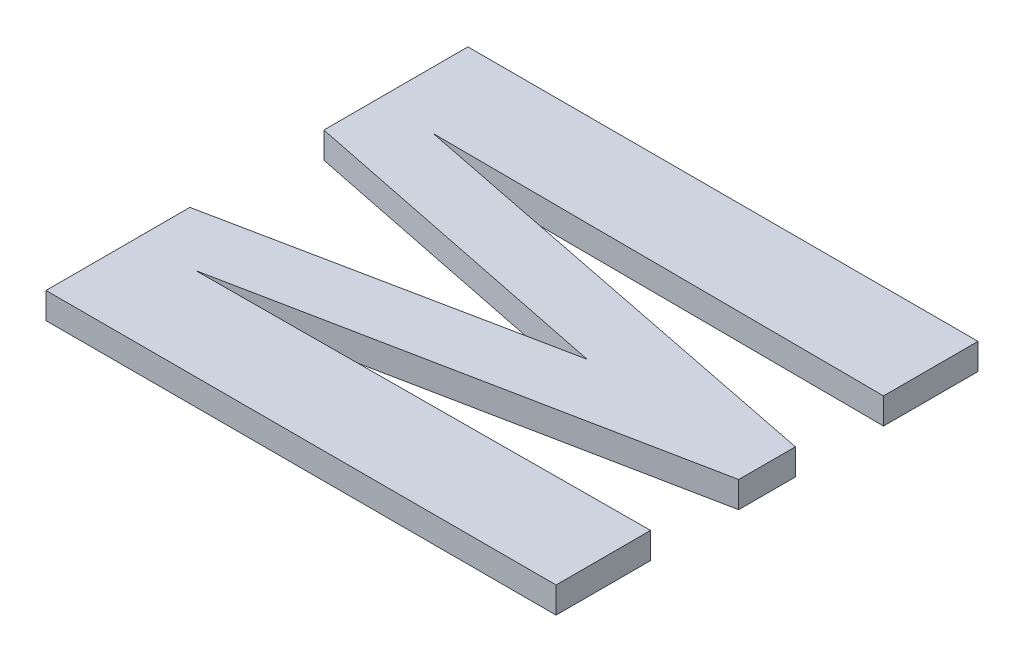
ISO-10303-21;
HEADER;
FILE_DESCRIPTION(('STEP AP214'),'2;1');
FILE_NAME('part.step','',(''),(''),'','','');
FILE_SCHEMA(('AUTOMOTIVE_DESIGN { 1 0 10303 214 1 1 1 1 }'));
ENDSEC;
DATA;
#1=APPLICATION_CONTEXT('core data for automotive mechanical design processes');
#2=APPLICATION_PROTOCOL_DEFINITION('international standard','automotive_design',2000,#1);
#3=PRODUCT_CONTEXT('',#1,'mechanical');
#4=PRODUCT('Part','Part','',(#3));
#5=PRODUCT_RELATED_PRODUCT_CATEGORY('part','',(#4));
#6=PRODUCT_DEFINITION_FORMATION('','',#4);
#7=PRODUCT_DEFINITION_CONTEXT('part definition',#1,'design');
#8=PRODUCT_DEFINITION('design','',#6,#7);
#9=PRODUCT_DEFINITION_SHAPE('','',#8);
#10=(LENGTH_UNIT() NAMED_UNIT(*) SI_UNIT(.MILLI.,.METRE.));
#11=(NAMED_UNIT(*) PLANE_ANGLE_UNIT() SI_UNIT($,.RADIAN.));
#12=(NAMED_UNIT(*) SI_UNIT($,.STERADIAN.) SOLID_ANGLE_UNIT());
#13=UNCERTAINTY_MEASURE_WITH_UNIT(LENGTH_MEASURE(1.E-05),#10,'distance_accuracy_value','');
#14=(GEOMETRIC_REPRESENTATION_CONTEXT(3) GLOBAL_UNCERTAINTY_ASSIGNED_CONTEXT((#13)) GLOBAL_UNIT_ASSIGNED_CONTEXT((#10,
#11,#12)) REPRESENTATION_CONTEXT('',''));
#15=CARTESIAN_POINT('',(0.,0.,0.));
#16=DIRECTION('',(0.,0.,1.));
#17=DIRECTION('',(1.,0.,0.));
#18=AXIS2_PLACEMENT_3D('',#15,#16,#17);
#19=CARTESIAN_POINT('',(2.3542541336,2.9906,-1.1725108816112));
#20=DIRECTION('',(1.,0.,0.));
#21=DIRECTION('',(0.,-1.,0.));
#22=AXIS2_PLACEMENT_3D('',#19,#20,#21);
#23=PLANE('',#22);
#24=DIRECTION('',(0.,0.,1.));
#25=VECTOR('',#24,1.);
#26=CARTESIAN_POINT('',(2.3542541336,2.9306,-1.1725108816112));
#27=LINE('',#26,#25);
#28=CARTESIAN_POINT('',(2.3542541336,2.9306,-1.1725108816112));
#29=VERTEX_POINT('',#28);
#30=CARTESIAN_POINT('',(2.3542541336,2.9306,-0.95584421494453));
#31=VERTEX_POINT('',#30);
#32=EDGE_CURVE('E11',#29,#31,#27,.T.);
#33=ORIENTED_EDGE('',*,*,#32,.F.);
#34=DIRECTION('',(0.,-1.,0.));
#35=VECTOR('',#34,1.);
#36=CARTESIAN_POINT('',(2.3542541336,2.9906,-1.1725108816112));
#37=LINE('',#36,#35);
#38=CARTESIAN_POINT('',(2.3542541336,2.9906,-1.1725108816112));
#39=VERTEX_POINT('',#38);
#40=EDGE_CURVE('E24',#39,#29,#37,.T.);
#41=ORIENTED_EDGE('',*,*,#40,.F.);
#42=DIRECTION('',(0.,0.,1.));
#43=VECTOR('',#42,1.);
#44=CARTESIAN_POINT('',(2.3542541336,2.9906,-1.1725108816112));
#45=LINE('',#44,#43);
#46=CARTESIAN_POINT('',(2.3542541336,2.9906,-0.95584421494453));
#47=VERTEX_POINT('',#46);
#48=EDGE_CURVE('E224',#39,#47,#45,.T.);
#49=ORIENTED_EDGE('',*,*,#48,.T.);
#50=DIRECTION('',(0.,-1.,0.));
#51=VECTOR('',#50,1.);
#52=CARTESIAN_POINT('',(2.3542541336,2.9906,-0.95584421494453));
#53=LINE('',#52,#51);
#54=EDGE_CURVE('E132',#47,#31,#53,.T.);
#55=ORIENTED_EDGE('',*,*,#54,.T.);
#56=EDGE_LOOP('',(#33,#41,#49,#55));
#57=FACE_BOUND('',#56,.T.);
#58=ADVANCED_FACE('F17',(#57),#23,.T.);
#59=CARTESIAN_POINT('',(1.3165110780444,2.9906,-1.1670942149445));
#60=DIRECTION('',(-0.0052195896190482,0.,-0.999986377849323));
#61=DIRECTION('',(-0.999986377849323,0.,0.0052195896190482));
#62=AXIS2_PLACEMENT_3D('',#59,#60,#61);
#63=PLANE('',#62);
#64=DIRECTION('',(0.999986377849323,0.,-0.0052195896190482));
#65=VECTOR('',#64,1.);
#66=CARTESIAN_POINT('',(1.3165110780444,2.9306,-1.1670942149445));
#67=LINE('',#66,#65);
#68=CARTESIAN_POINT('',(1.3165110780444,2.9306,-1.1670942149445));
#69=VERTEX_POINT('',#68);
#70=EDGE_CURVE('E221',#69,#29,#67,.T.);
#71=ORIENTED_EDGE('',*,*,#70,.F.);
#72=DIRECTION('',(0.,-1.,0.));
#73=VECTOR('',#72,1.);
#74=CARTESIAN_POINT('',(1.3165110780444,2.9906,-1.1670942149445));
#75=LINE('',#74,#73);
#76=CARTESIAN_POINT('',(1.3165110780444,2.9906,-1.1670942149445));
#77=VERTEX_POINT('',#76);
#78=EDGE_CURVE('E218',#77,#69,#75,.T.);
#79=ORIENTED_EDGE('',*,*,#78,.F.);
#80=DIRECTION('',(0.999986377849323,0.,-0.0052195896190482));
#81=VECTOR('',#80,1.);
#82=CARTESIAN_POINT('',(1.3165110780444,2.9906,-1.1670942149445));
#83=LINE('',#82,#81);
#84=EDGE_CURVE('E215',#77,#39,#83,.T.);
#85=ORIENTED_EDGE('',*,*,#84,.T.);
#86=ORIENTED_EDGE('',*,*,#40,.T.);
#87=EDGE_LOOP('',(#71,#79,#85,#86));
#88=FACE_BOUND('',#87,.T.);
#89=ADVANCED_FACE('F226',(#88),#63,.T.);
#90=CARTESIAN_POINT('',(2.3542541336,2.9906,-1.3747331038334));
#91=DIRECTION('',(0.196198157093014,0.,0.980564267732261));
#92=DIRECTION('',(0.980564267732261,0.,-0.196198157093014));
#93=AXIS2_PLACEMENT_3D('',#90,#91,#92);
#94=PLANE('',#93);
#95=DIRECTION('',(-0.980564267732261,0.,0.196198157093014));
#96=VECTOR('',#95,1.);
#97=CARTESIAN_POINT('',(2.3542541336,2.9306,-1.3747331038334));
#98=LINE('',#97,#96);
#99=CARTESIAN_POINT('',(2.3542541336,2.9306,-1.3747331038334));
#100=VERTEX_POINT('',#99);
#101=EDGE_CURVE('E212',#100,#69,#98,.T.);
#102=ORIENTED_EDGE('',*,*,#101,.F.);
#103=DIRECTION('',(0.,-1.,0.));
#104=VECTOR('',#103,1.);
#105=CARTESIAN_POINT('',(2.3542541336,2.9906,-1.3747331038334));
#106=LINE('',#105,#104);
#107=CARTESIAN_POINT('',(2.3542541336,2.9906,-1.3747331038334));
#108=VERTEX_POINT('',#107);
#109=EDGE_CURVE('E209',#108,#100,#106,.T.);
#110=ORIENTED_EDGE('',*,*,#109,.F.);
#111=DIRECTION('',(-0.980564267732261,0.,0.196198157093014));
#112=VECTOR('',#111,1.);
#113=CARTESIAN_POINT('',(2.3542541336,2.9906,-1.3747331038334));
#114=LINE('',#113,#112);
#115=EDGE_CURVE('E206',#108,#77,#114,.T.);
#116=ORIENTED_EDGE('',*,*,#115,.T.);
#117=ORIENTED_EDGE('',*,*,#78,.T.);
#118=EDGE_LOOP('',(#102,#110,#116,#117));
#119=FACE_BOUND('',#118,.T.);
#120=ADVANCED_FACE('F230',(#119),#94,.T.);
#121=CARTESIAN_POINT('',(2.3542541336,2.9906,-1.5047331038334));
#122=DIRECTION('',(1.,0.,0.));
#123=DIRECTION('',(0.,-1.,0.));
#124=AXIS2_PLACEMENT_3D('',#121,#122,#123);
#125=PLANE('',#124);
#126=DIRECTION('',(0.,0.,1.));
#127=VECTOR('',#126,1.);
#128=CARTESIAN_POINT('',(2.3542541336,2.9306,-1.5047331038334));
#129=LINE('',#128,#127);
#130=CARTESIAN_POINT('',(2.3542541336,2.9306,-1.5047331038334));
#131=VERTEX_POINT('',#130);
#132=EDGE_CURVE('E203',#131,#100,#129,.T.);
#133=ORIENTED_EDGE('',*,*,#132,.F.);
#134=DIRECTION('',(0.,-1.,0.));
#135=VECTOR('',#134,1.);
#136=CARTESIAN_POINT('',(2.3542541336,2.9906,-1.5047331038334));
#137=LINE('',#136,#135);
#138=CARTESIAN_POINT('',(2.3542541336,2.9906,-1.5047331038334));
#139=VERTEX_POINT('',#138);
#140=EDGE_CURVE('E200',#139,#131,#137,.T.);
#141=ORIENTED_EDGE('',*,*,#140,.F.);
#142=DIRECTION('',(0.,0.,1.));
#143=VECTOR('',#142,1.);
#144=CARTESIAN_POINT('',(2.3542541336,2.9906,-1.5047331038334));
#145=LINE('',#144,#143);
#146=EDGE_CURVE('E197',#139,#108,#145,.T.);
#147=ORIENTED_EDGE('',*,*,#146,.T.);
#148=ORIENTED_EDGE('',*,*,#109,.T.);
#149=EDGE_LOOP('',(#133,#141,#147,#148));
#150=FACE_BOUND('',#149,.T.);
#151=ADVANCED_FACE('F233',(#150),#125,.T.);
#152=CARTESIAN_POINT('',(1.3165110780444,2.9906,-1.711694909389));
#153=DIRECTION('',(0.195582892151717,0.,-0.980687173515372));
#154=DIRECTION('',(-0.980687173515372,0.,-0.195582892151717));
#155=AXIS2_PLACEMENT_3D('',#152,#153,#154);
#156=PLANE('',#155);
#157=DIRECTION('',(0.980687173515372,0.,0.195582892151717));
#158=VECTOR('',#157,1.);
#159=CARTESIAN_POINT('',(1.3165110780444,2.9306,-1.711694909389));
#160=LINE('',#159,#158);
#161=CARTESIAN_POINT('',(1.3165110780444,2.9306,-1.711694909389));
#162=VERTEX_POINT('',#161);
#163=EDGE_CURVE('E194',#162,#131,#160,.T.);
#164=ORIENTED_EDGE('',*,*,#163,.F.);
#165=DIRECTION('',(0.,-1.,0.));
#166=VECTOR('',#165,1.);
#167=CARTESIAN_POINT('',(1.3165110780444,2.9906,-1.711694909389));
#168=LINE('',#167,#166);
#169=CARTESIAN_POINT('',(1.3165110780444,2.9906,-1.711694909389));
#170=VERTEX_POINT('',#169);
#171=EDGE_CURVE('E191',#170,#162,#168,.T.);
#172=ORIENTED_EDGE('',*,*,#171,.F.);
#173=DIRECTION('',(0.980687173515372,0.,0.195582892151717));
#174=VECTOR('',#173,1.);
#175=CARTESIAN_POINT('',(1.3165110780444,2.9906,-1.711694909389));
#176=LINE('',#175,#174);
#177=EDGE_CURVE('E188',#170,#139,#176,.T.);
#178=ORIENTED_EDGE('',*,*,#177,.T.);
#179=ORIENTED_EDGE('',*,*,#140,.T.);
#180=EDGE_LOOP('',(#164,#172,#178,#179));
#181=FACE_BOUND('',#180,.T.);
#182=ADVANCED_FACE('F238',(#181),#156,.T.);
#183=CARTESIAN_POINT('',(2.3542541336,2.9906,-1.7069553260556));
#184=DIRECTION('',(-0.0045671554981102,0.,0.999989570490941));
#185=DIRECTION('',(0.999989570490941,0.,0.0045671554981102));
#186=AXIS2_PLACEMENT_3D('',#183,#184,#185);
#187=PLANE('',#186);
#188=DIRECTION('',(-0.999989570490941,0.,-0.0045671554981102));
#189=VECTOR('',#188,1.);
#190=CARTESIAN_POINT('',(2.3542541336,2.9306,-1.7069553260556));
#191=LINE('',#190,#189);
#192=CARTESIAN_POINT('',(2.3542541336,2.9306,-1.7069553260556));
#193=VERTEX_POINT('',#192);
#194=EDGE_CURVE('E185',#193,#162,#191,.T.);
#195=ORIENTED_EDGE('',*,*,#194,.F.);
#196=DIRECTION('',(0.,-1.,0.));
#197=VECTOR('',#196,1.);
#198=CARTESIAN_POINT('',(2.3542541336,2.9906,-1.7069553260556));
#199=LINE('',#198,#197);
#200=CARTESIAN_POINT('',(2.3542541336,2.9906,-1.7069553260556));
#201=VERTEX_POINT('',#200);
#202=EDGE_CURVE('E182',#201,#193,#199,.T.);
#203=ORIENTED_EDGE('',*,*,#202,.F.);
#204=DIRECTION('',(-0.999989570490941,0.,-0.0045671554981102));
#205=VECTOR('',#204,1.);
#206=CARTESIAN_POINT('',(2.3542541336,2.9906,-1.7069553260556));
#207=LINE('',#206,#205);
#208=EDGE_CURVE('E179',#201,#170,#207,.T.);
#209=ORIENTED_EDGE('',*,*,#208,.T.);
#210=ORIENTED_EDGE('',*,*,#171,.T.);
#211=EDGE_LOOP('',(#195,#203,#209,#210));
#212=FACE_BOUND('',#211,.T.);
#213=ADVANCED_FACE('F240',(#212),#187,.T.);
#214=CARTESIAN_POINT('',(2.3542541336,2.9906,-1.9236219927223));
#215=DIRECTION('',(1.,0.,0.));
#216=DIRECTION('',(0.,-1.,0.));
#217=AXIS2_PLACEMENT_3D('',#214,#215,#216);
#218=PLANE('',#217);
#219=DIRECTION('',(0.,0.,1.));
#220=VECTOR('',#219,1.);
#221=CARTESIAN_POINT('',(2.3542541336,2.9306,-1.9236219927223));
#222=LINE('',#221,#220);
#223=CARTESIAN_POINT('',(2.3542541336,2.9306,-1.9236219927223));
#224=VERTEX_POINT('',#223);
#225=EDGE_CURVE('E176',#224,#193,#222,.T.);
#226=ORIENTED_EDGE('',*,*,#225,.F.);
#227=DIRECTION('',(0.,-1.,0.));
#228=VECTOR('',#227,1.);
#229=CARTESIAN_POINT('',(2.3542541336,2.9906,-1.9236219927223));
#230=LINE('',#229,#228);
#231=CARTESIAN_POINT('',(2.3542541336,2.9906,-1.9236219927223));
#232=VERTEX_POINT('',#231);
#233=EDGE_CURVE('E173',#232,#224,#230,.T.);
#234=ORIENTED_EDGE('',*,*,#233,.F.);
#235=DIRECTION('',(0.,0.,1.));
#236=VECTOR('',#235,1.);
#237=CARTESIAN_POINT('',(2.3542541336,2.9906,-1.9236219927223));
#238=LINE('',#237,#236);
#239=EDGE_CURVE('E170',#232,#201,#238,.T.);
#240=ORIENTED_EDGE('',*,*,#239,.T.);
#241=ORIENTED_EDGE('',*,*,#202,.T.);
#242=EDGE_LOOP('',(#226,#234,#240,#241));
#243=FACE_BOUND('',#242,.T.);
#244=ADVANCED_FACE('F242',(#243),#218,.T.);
#245=CARTESIAN_POINT('',(1.1842541336,2.9906,-1.9236219927223));
#246=DIRECTION('',(0.,0.,-1.));
#247=DIRECTION('',(0.,1.,0.));
#248=AXIS2_PLACEMENT_3D('',#245,#246,#247);
#249=PLANE('',#248);
#250=DIRECTION('',(1.,0.,0.));
#251=VECTOR('',#250,1.);
#252=CARTESIAN_POINT('',(1.1842541336,2.9306,-1.9236219927223));
#253=LINE('',#252,#251);
#254=CARTESIAN_POINT('',(1.1842541336,2.9306,-1.9236219927223));
#255=VERTEX_POINT('',#254);
#256=EDGE_CURVE('E167',#255,#224,#253,.T.);
#257=ORIENTED_EDGE('',*,*,#256,.F.);
#258=DIRECTION('',(0.,-1.,0.));
#259=VECTOR('',#258,1.);
#260=CARTESIAN_POINT('',(1.1842541336,2.9906,-1.9236219927223));
#261=LINE('',#260,#259);
#262=CARTESIAN_POINT('',(1.1842541336,2.9906,-1.9236219927223));
#263=VERTEX_POINT('',#262);
#264=EDGE_CURVE('E164',#263,#255,#261,.T.);
#265=ORIENTED_EDGE('',*,*,#264,.F.);
#266=DIRECTION('',(1.,0.,0.));
#267=VECTOR('',#266,1.);
#268=CARTESIAN_POINT('',(1.1842541336,2.9906,-1.9236219927223));
#269=LINE('',#268,#267);
#270=EDGE_CURVE('E161',#263,#232,#269,.T.);
#271=ORIENTED_EDGE('',*,*,#270,.T.);
#272=ORIENTED_EDGE('',*,*,#233,.T.);
#273=EDGE_LOOP('',(#257,#265,#271,#272));
#274=FACE_BOUND('',#273,.T.);
#275=ADVANCED_FACE('F245',(#274),#249,.T.);
#276=CARTESIAN_POINT('',(1.1842541336,2.9906,-1.5932053260556));
#277=DIRECTION('',(-1.,0.,0.));
#278=DIRECTION('',(0.,1.,0.));
#279=AXIS2_PLACEMENT_3D('',#276,#277,#278);
#280=PLANE('',#279);
#281=DIRECTION('',(0.,0.,-1.));
#282=VECTOR('',#281,1.);
#283=CARTESIAN_POINT('',(1.1842541336,2.9306,-1.5932053260556));
#284=LINE('',#283,#282);
#285=CARTESIAN_POINT('',(1.1842541336,2.9306,-1.5932053260556));
#286=VERTEX_POINT('',#285);
#287=EDGE_CURVE('E158',#286,#255,#284,.T.);
#288=ORIENTED_EDGE('',*,*,#287,.F.);
#289=DIRECTION('',(0.,-1.,0.));
#290=VECTOR('',#289,1.);
#291=CARTESIAN_POINT('',(1.1842541336,2.9906,-1.5932053260556));
#292=LINE('',#291,#290);
#293=CARTESIAN_POINT('',(1.1842541336,2.9906,-1.5932053260556));
#294=VERTEX_POINT('',#293);
#295=EDGE_CURVE('E155',#294,#286,#292,.T.);
#296=ORIENTED_EDGE('',*,*,#295,.F.);
#297=DIRECTION('',(0.,0.,-1.));
#298=VECTOR('',#297,1.);
#299=CARTESIAN_POINT('',(1.1842541336,2.9906,-1.5932053260556));
#300=LINE('',#299,#298);
#301=EDGE_CURVE('E152',#294,#263,#300,.T.);
#302=ORIENTED_EDGE('',*,*,#301,.T.);
#303=ORIENTED_EDGE('',*,*,#264,.T.);
#304=EDGE_LOOP('',(#288,#296,#302,#303));
#305=FACE_BOUND('',#304,.T.);
#306=ADVANCED_FACE('F249',(#305),#280,.T.);
#307=CARTESIAN_POINT('',(1.9416846891555,2.9906,-1.4397331038334));
#308=DIRECTION('',(-0.198586612796024,0.,0.980083341975672));
#309=DIRECTION('',(0.980083341975672,0.,0.198586612796024));
#310=AXIS2_PLACEMENT_3D('',#307,#308,#309);
#311=PLANE('',#310);
#312=DIRECTION('',(-0.980083341975672,0.,-0.198586612796024));
#313=VECTOR('',#312,1.);
#314=CARTESIAN_POINT('',(1.9416846891555,2.9306,-1.4397331038334));
#315=LINE('',#314,#313);
#316=CARTESIAN_POINT('',(1.9416846891555,2.9306,-1.4397331038334));
#317=VERTEX_POINT('',#316);
#318=EDGE_CURVE('E149',#317,#286,#315,.T.);
#319=ORIENTED_EDGE('',*,*,#318,.F.);
#320=DIRECTION('',(0.,-1.,0.));
#321=VECTOR('',#320,1.);
#322=CARTESIAN_POINT('',(1.9416846891555,2.9906,-1.4397331038334));
#323=LINE('',#322,#321);
#324=CARTESIAN_POINT('',(1.9416846891555,2.9906,-1.4397331038334));
#325=VERTEX_POINT('',#324);
#326=EDGE_CURVE('E146',#325,#317,#323,.T.);
#327=ORIENTED_EDGE('',*,*,#326,.F.);
#328=DIRECTION('',(-0.980083341975672,0.,-0.198586612796024));
#329=VECTOR('',#328,1.);
#330=CARTESIAN_POINT('',(1.9416846891555,2.9906,-1.4397331038334));
#331=LINE('',#330,#329);
#332=EDGE_CURVE('E143',#325,#294,#331,.T.);
#333=ORIENTED_EDGE('',*,*,#332,.T.);
#334=ORIENTED_EDGE('',*,*,#295,.T.);
#335=EDGE_LOOP('',(#319,#327,#333,#334));
#336=FACE_BOUND('',#335,.T.);
#337=ADVANCED_FACE('F251',(#336),#311,.T.);
#338=CARTESIAN_POINT('',(1.1842541336,2.9906,-1.2858094927223));
#339=DIRECTION('',(-0.199147559292578,0.,-0.979969514642067));
#340=DIRECTION('',(-0.979969514642067,0.,0.199147559292578));
#341=AXIS2_PLACEMENT_3D('',#338,#339,#340);
#342=PLANE('',#341);
#343=DIRECTION('',(0.979969514642067,0.,-0.199147559292578));
#344=VECTOR('',#343,1.);
#345=CARTESIAN_POINT('',(1.1842541336,2.9306,-1.2858094927223));
#346=LINE('',#345,#344);
#347=CARTESIAN_POINT('',(1.1842541336,2.9306,-1.2858094927223));
#348=VERTEX_POINT('',#347);
#349=EDGE_CURVE('E140',#348,#317,#346,.T.);
#350=ORIENTED_EDGE('',*,*,#349,.F.);
#351=DIRECTION('',(0.,-1.,0.));
#352=VECTOR('',#351,1.);
#353=CARTESIAN_POINT('',(1.1842541336,2.9906,-1.2858094927223));
#354=LINE('',#353,#352);
#355=CARTESIAN_POINT('',(1.1842541336,2.9906,-1.2858094927223));
#356=VERTEX_POINT('',#355);
#357=EDGE_CURVE('E138',#356,#348,#354,.T.);
#358=ORIENTED_EDGE('',*,*,#357,.F.);
#359=DIRECTION('',(0.979969514642067,0.,-0.199147559292578));
#360=VECTOR('',#359,1.);
#361=CARTESIAN_POINT('',(1.1842541336,2.9906,-1.2858094927223));
#362=LINE('',#361,#360);
#363=EDGE_CURVE('E127',#356,#325,#362,.T.);
#364=ORIENTED_EDGE('',*,*,#363,.T.);
#365=ORIENTED_EDGE('',*,*,#326,.T.);
#366=EDGE_LOOP('',(#350,#358,#364,#365));
#367=FACE_BOUND('',#366,.T.);
#368=ADVANCED_FACE('F253',(#367),#342,.T.);
#369=CARTESIAN_POINT('',(1.1842541336,2.9906,-0.95584421494453));
#370=DIRECTION('',(-1.,0.,0.));
#371=DIRECTION('',(0.,1.,0.));
#372=AXIS2_PLACEMENT_3D('',#369,#370,#371);
#373=PLANE('',#372);
#374=DIRECTION('',(0.,0.,-1.));
#375=VECTOR('',#374,1.);
#376=CARTESIAN_POINT('',(1.1842541336,2.9306,-0.95584421494453));
#377=LINE('',#376,#375);
#378=CARTESIAN_POINT('',(1.1842541336,2.9306,-0.95584421494453));
#379=VERTEX_POINT('',#378);
#380=EDGE_CURVE('E114',#379,#348,#377,.T.);
#381=ORIENTED_EDGE('',*,*,#380,.F.);
#382=DIRECTION('',(0.,-1.,0.));
#383=VECTOR('',#382,1.);
#384=CARTESIAN_POINT('',(1.1842541336,2.9906,-0.95584421494453));
#385=LINE('',#384,#383);
#386=CARTESIAN_POINT('',(1.1842541336,2.9906,-0.95584421494453));
#387=VERTEX_POINT('',#386);
#388=EDGE_CURVE('E108',#387,#379,#385,.T.);
#389=ORIENTED_EDGE('',*,*,#388,.F.);
#390=DIRECTION('',(0.,0.,-1.));
#391=VECTOR('',#390,1.);
#392=CARTESIAN_POINT('',(1.1842541336,2.9906,-0.95584421494453));
#393=LINE('',#392,#391);
#394=EDGE_CURVE('E112',#387,#356,#393,.T.);
#395=ORIENTED_EDGE('',*,*,#394,.T.);
#396=ORIENTED_EDGE('',*,*,#357,.T.);
#397=EDGE_LOOP('',(#381,#389,#395,#396));
#398=FACE_BOUND('',#397,.T.);
#399=ADVANCED_FACE('F110',(#398),#373,.T.);
#400=CARTESIAN_POINT('',(2.3542541336,2.9906,-0.95584421494453));
#401=DIRECTION('',(0.,0.,1.));
#402=DIRECTION('',(0.,-1.,0.));
#403=AXIS2_PLACEMENT_3D('',#400,#401,#402);
#404=PLANE('',#403);
#405=DIRECTION('',(-1.,0.,0.));
#406=VECTOR('',#405,1.);
#407=CARTESIAN_POINT('',(2.3542541336,2.9306,-0.95584421494453));
#408=LINE('',#407,#406);
#409=EDGE_CURVE('E128',#31,#379,#408,.T.);
#410=ORIENTED_EDGE('',*,*,#409,.F.);
#411=ORIENTED_EDGE('',*,*,#54,.F.);
#412=DIRECTION('',(-1.,0.,0.));
#413=VECTOR('',#412,1.);
#414=CARTESIAN_POINT('',(2.3542541336,2.9906,-0.95584421494453));
#415=LINE('',#414,#413);
#416=EDGE_CURVE('E124',#47,#387,#415,.T.);
#417=ORIENTED_EDGE('',*,*,#416,.T.);
#418=ORIENTED_EDGE('',*,*,#388,.T.);
#419=EDGE_LOOP('',(#410,#411,#417,#418));
#420=FACE_BOUND('',#419,.T.);
#421=ADVANCED_FACE('F131',(#420),#404,.T.);
#422=CARTESIAN_POINT('',(0.,2.9906,0.));
#423=DIRECTION('',(0.,-1.,0.));
#424=DIRECTION('',(-1.,0.,0.));
#425=AXIS2_PLACEMENT_3D('',#422,#423,#424);
#426=PLANE('',#425);
#427=ORIENTED_EDGE('',*,*,#48,.F.);
#428=ORIENTED_EDGE('',*,*,#84,.F.);
#429=ORIENTED_EDGE('',*,*,#115,.F.);
#430=ORIENTED_EDGE('',*,*,#146,.F.);
#431=ORIENTED_EDGE('',*,*,#177,.F.);
#432=ORIENTED_EDGE('',*,*,#208,.F.);
#433=ORIENTED_EDGE('',*,*,#239,.F.);
#434=ORIENTED_EDGE('',*,*,#270,.F.);
#435=ORIENTED_EDGE('',*,*,#301,.F.);
#436=ORIENTED_EDGE('',*,*,#332,.F.);
#437=ORIENTED_EDGE('',*,*,#363,.F.);
#438=ORIENTED_EDGE('',*,*,#394,.F.);
#439=ORIENTED_EDGE('',*,*,#416,.F.);
#440=EDGE_LOOP('',(#427,#428,#429,#430,#431,#432,#433,#434,#435,#436,#437,#438,#439));
#441=FACE_BOUND('',#440,.T.);
#442=ADVANCED_FACE('F123',(#441),#426,.F.);
#443=CARTESIAN_POINT('',(0.,2.9306,0.));
#444=DIRECTION('',(0.,-1.,0.));
#445=DIRECTION('',(-1.,0.,0.));
#446=AXIS2_PLACEMENT_3D('',#443,#444,#445);
#447=PLANE('',#446);
#448=ORIENTED_EDGE('',*,*,#32,.T.);
#449=ORIENTED_EDGE('',*,*,#409,.T.);
#450=ORIENTED_EDGE('',*,*,#380,.T.);
#451=ORIENTED_EDGE('',*,*,#349,.T.);
#452=ORIENTED_EDGE('',*,*,#318,.T.);
#453=ORIENTED_EDGE('',*,*,#287,.T.);
#454=ORIENTED_EDGE('',*,*,#256,.T.);
#455=ORIENTED_EDGE('',*,*,#225,.T.);
#456=ORIENTED_EDGE('',*,*,#194,.T.);
#457=ORIENTED_EDGE('',*,*,#163,.T.);
#458=ORIENTED_EDGE('',*,*,#132,.T.);
#459=ORIENTED_EDGE('',*,*,#101,.T.);
#460=ORIENTED_EDGE('',*,*,#70,.T.);
#461=EDGE_LOOP('',(#448,#449,#450,#451,#452,#453,#454,#455,#456,#457,#458,#459,#460));
#462=FACE_BOUND('',#461,.T.);
#463=ADVANCED_FACE('F228',(#462),#447,.T.);
#464=CLOSED_SHELL('',(#58,#89,#120,#151,#182,#213,#244,#275,#306,#337,#368,#399,#421,#442,#463));
#465=MANIFOLD_SOLID_BREP('B1',#464);
#466=ADVANCED_BREP_SHAPE_REPRESENTATION('',(#18,#465),#14);
#467=SHAPE_DEFINITION_REPRESENTATION(#9,#466);
ENDSEC;
END-ISO-10303-21;
